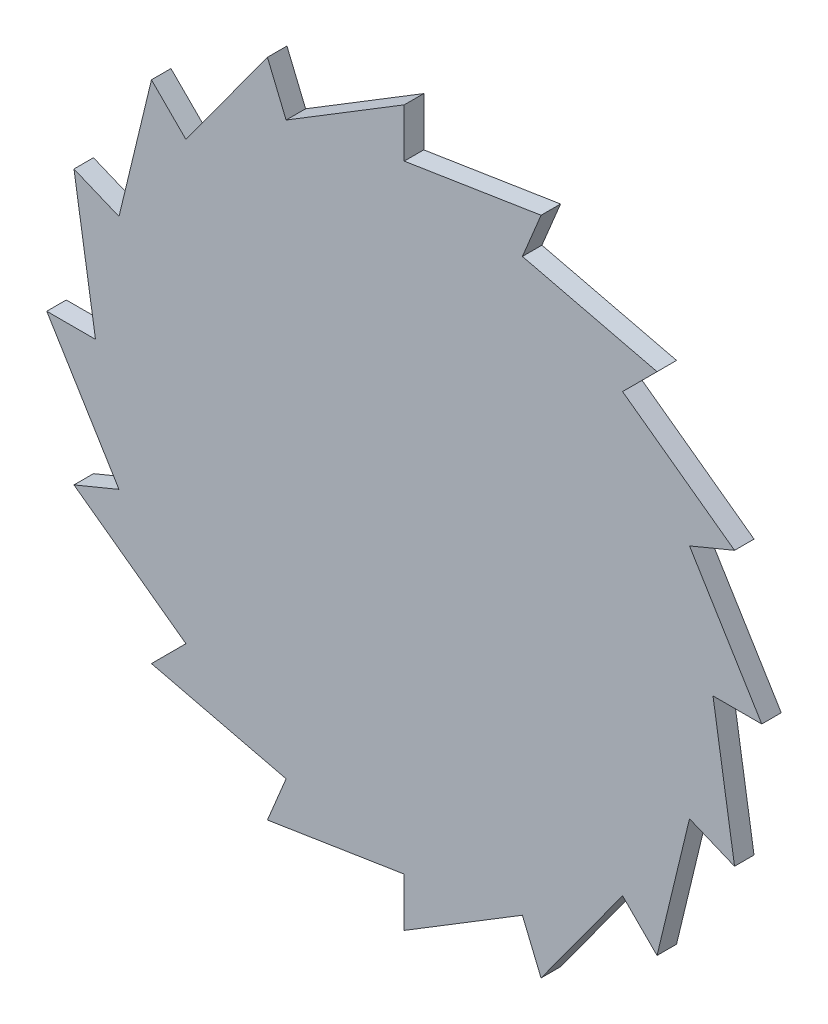
ISO-10303-21;
HEADER;
FILE_DESCRIPTION(('STEP AP214'),'2;1');
FILE_NAME('part.step','',(''),(''),'','','');
FILE_SCHEMA(('AUTOMOTIVE_DESIGN { 1 0 10303 214 1 1 1 1 }'));
ENDSEC;
DATA;
#1=APPLICATION_CONTEXT('core data for automotive mechanical design processes');
#2=APPLICATION_PROTOCOL_DEFINITION('international standard','automotive_design',2000,#1);
#3=PRODUCT_CONTEXT('',#1,'mechanical');
#4=PRODUCT('Part','Part','',(#3));
#5=PRODUCT_RELATED_PRODUCT_CATEGORY('part','',(#4));
#6=PRODUCT_DEFINITION_FORMATION('','',#4);
#7=PRODUCT_DEFINITION_CONTEXT('part definition',#1,'design');
#8=PRODUCT_DEFINITION('design','',#6,#7);
#9=PRODUCT_DEFINITION_SHAPE('','',#8);
#10=(LENGTH_UNIT() NAMED_UNIT(*) SI_UNIT(.MILLI.,.METRE.));
#11=(NAMED_UNIT(*) PLANE_ANGLE_UNIT() SI_UNIT($,.RADIAN.));
#12=(NAMED_UNIT(*) SI_UNIT($,.STERADIAN.) SOLID_ANGLE_UNIT());
#13=UNCERTAINTY_MEASURE_WITH_UNIT(LENGTH_MEASURE(1.E-05),#10,'distance_accuracy_value','');
#14=(GEOMETRIC_REPRESENTATION_CONTEXT(3) GLOBAL_UNCERTAINTY_ASSIGNED_CONTEXT((#13)) GLOBAL_UNIT_ASSIGNED_CONTEXT((#10,
#11,#12)) REPRESENTATION_CONTEXT('',''));
#15=CARTESIAN_POINT('',(0.,0.,0.));
#16=DIRECTION('',(0.,0.,1.));
#17=DIRECTION('',(1.,0.,0.));
#18=AXIS2_PLACEMENT_3D('',#15,#16,#17);
#19=CARTESIAN_POINT('',(0.,0.,3.));
#20=DIRECTION('',(0.,0.,1.));
#21=DIRECTION('',(1.,0.,0.));
#22=AXIS2_PLACEMENT_3D('',#19,#20,#21);
#23=PLANE('',#22);
#24=DIRECTION('',(-0.923879532511253,0.382683432365171,0.));
#25=VECTOR('',#24,1.);
#26=CARTESIAN_POINT('',(0.,0.,3.));
#27=LINE('',#26,#25);
#28=CARTESIAN_POINT('',(-43.8842777942864,18.1774630373464,3.));
#29=VERTEX_POINT('',#28);
#30=CARTESIAN_POINT('',(-50.8133742881189,21.0475887800844,3.));
#31=VERTEX_POINT('',#30);
#32=EDGE_CURVE('E451',#29,#31,#27,.T.);
#33=ORIENTED_EDGE('',*,*,#32,.T.);
#34=DIRECTION('',(-0.155507881197149,0.987834651591841,0.));
#35=VECTOR('',#34,1.);
#36=CARTESIAN_POINT('',(-46.3513216970647,-7.29676349800314,3.));
#37=LINE('',#36,#35);
#38=CARTESIAN_POINT('',(-47.5,0.,3.));
#39=VERTEX_POINT('',#38);
#40=EDGE_CURVE('E432',#39,#31,#37,.T.);
#41=ORIENTED_EDGE('',*,*,#40,.F.);
#42=DIRECTION('',(-1.,0.,0.));
#43=VECTOR('',#42,1.);
#44=CARTESIAN_POINT('',(0.,0.,3.));
#45=LINE('',#44,#43);
#46=CARTESIAN_POINT('',(-55.,0.,3.));
#47=VERTEX_POINT('',#46);
#48=EDGE_CURVE('E439',#39,#47,#45,.T.);
#49=ORIENTED_EDGE('',*,*,#48,.T.);
#50=DIRECTION('',(-0.521698503662581,0.853129926374772,0.));
#51=VECTOR('',#50,1.);
#52=CARTESIAN_POINT('',(-40.0306869201923,-24.4792133310718,3.));
#53=LINE('',#52,#51);
#54=CARTESIAN_POINT('',(-43.8842777942861,-18.1774630373418,3.));
#55=VERTEX_POINT('',#54);
#56=EDGE_CURVE('E558',#55,#47,#53,.T.);
#57=ORIENTED_EDGE('',*,*,#56,.F.);
#58=DIRECTION('',(-0.923879532511286,-0.382683432365091,0.));
#59=VECTOR('',#58,1.);
#60=CARTESIAN_POINT('',(0.,0.,3.));
#61=LINE('',#60,#59);
#62=CARTESIAN_POINT('',(-50.8133742881207,-21.04758878008,3.));
#63=VERTEX_POINT('',#62);
#64=EDGE_CURVE('E560',#55,#63,#61,.T.);
#65=ORIENTED_EDGE('',*,*,#64,.T.);
#66=DIRECTION('',(-0.808465258154098,0.588543903509184,0.));
#67=VECTOR('',#66,1.);
#68=CARTESIAN_POINT('',(-27.6157429388011,-37.9349248391062,3.));
#69=LINE('',#68,#67);
#70=CARTESIAN_POINT('',(-33.587572106361,-33.5875721063611,3.));
#71=VERTEX_POINT('',#70);
#72=EDGE_CURVE('E461',#71,#63,#69,.T.);
#73=ORIENTED_EDGE('',*,*,#72,.F.);
#74=DIRECTION('',(-0.707106781186547,-0.707106781186548,0.));
#75=VECTOR('',#74,1.);
#76=CARTESIAN_POINT('',(0.,0.,3.));
#77=LINE('',#76,#75);
#78=CARTESIAN_POINT('',(-38.8908729652601,-38.8908729652601,3.));
#79=VERTEX_POINT('',#78);
#80=EDGE_CURVE('E463',#71,#79,#77,.T.);
#81=ORIENTED_EDGE('',*,*,#80,.T.);
#82=DIRECTION('',(-0.972150505847468,0.234357406498093,0.));
#83=VECTOR('',#82,1.);
#84=CARTESIAN_POINT('',(-10.9965524323105,-45.6153879213366,3.));
#85=LINE('',#84,#83);
#86=CARTESIAN_POINT('',(-18.1774630373417,-43.8842777942862,3.));
#87=VERTEX_POINT('',#86);
#88=EDGE_CURVE('E571',#87,#79,#85,.T.);
#89=ORIENTED_EDGE('',*,*,#88,.F.);
#90=DIRECTION('',(-0.382683432365088,-0.923879532511288,0.));
#91=VECTOR('',#90,1.);
#92=CARTESIAN_POINT('',(0.,0.,3.));
#93=LINE('',#92,#91);
#94=CARTESIAN_POINT('',(-21.0475887800798,-50.8133742881208,3.));
#95=VERTEX_POINT('',#94);
#96=EDGE_CURVE('E574',#87,#95,#93,.T.);
#97=ORIENTED_EDGE('',*,*,#96,.T.);
#98=DIRECTION('',(-0.98783465159184,-0.155507881197153,0.));
#99=VECTOR('',#98,1.);
#100=CARTESIAN_POINT('',(7.29676349800329,-46.3513216970647,3.));
#101=LINE('',#100,#99);
#102=CARTESIAN_POINT('',(1.65845363595049E-13,-47.5,3.));
#103=VERTEX_POINT('',#102);
#104=EDGE_CURVE('E475',#103,#95,#101,.T.);
#105=ORIENTED_EDGE('',*,*,#104,.F.);
#106=DIRECTION('',(0.,-1.,0.));
#107=VECTOR('',#106,1.);
#108=CARTESIAN_POINT('',(0.,0.,3.));
#109=LINE('',#108,#107);
#110=CARTESIAN_POINT('',(1.92031473636372E-13,-55.,3.));
#111=VERTEX_POINT('',#110);
#112=EDGE_CURVE('E477',#103,#111,#109,.T.);
#113=ORIENTED_EDGE('',*,*,#112,.T.);
#114=DIRECTION('',(-0.85312992637477,-0.521698503662584,0.));
#115=VECTOR('',#114,1.);
#116=CARTESIAN_POINT('',(24.4792133310719,-40.0306869201922,3.));
#117=LINE('',#116,#115);
#118=CARTESIAN_POINT('',(18.177463037342,-43.8842777942861,3.));
#119=VERTEX_POINT('',#118);
#120=EDGE_CURVE('E673',#119,#111,#117,.T.);
#121=ORIENTED_EDGE('',*,*,#120,.F.);
#122=DIRECTION('',(0.382683432365094,-0.923879532511285,0.));
#123=VECTOR('',#122,1.);
#124=CARTESIAN_POINT('',(0.,0.,3.));
#125=LINE('',#124,#123);
#126=CARTESIAN_POINT('',(21.0475887800802,-50.8133742881207,3.));
#127=VERTEX_POINT('',#126);
#128=EDGE_CURVE('E676',#119,#127,#125,.T.);
#129=ORIENTED_EDGE('',*,*,#128,.T.);
#130=DIRECTION('',(-0.58854390350918,-0.808465258154101,0.));
#131=VECTOR('',#130,1.);
#132=CARTESIAN_POINT('',(37.9349248391063,-27.6157429388009,3.));
#133=LINE('',#132,#131);
#134=CARTESIAN_POINT('',(33.5875721063612,-33.5875721063608,3.));
#135=VERTEX_POINT('',#134);
#136=EDGE_CURVE('E489',#135,#127,#133,.T.);
#137=ORIENTED_EDGE('',*,*,#136,.F.);
#138=DIRECTION('',(0.707106781186551,-0.707106781186544,0.));
#139=VECTOR('',#138,1.);
#140=CARTESIAN_POINT('',(0.,0.,3.));
#141=LINE('',#140,#139);
#142=CARTESIAN_POINT('',(38.8908729652603,-38.8908729652599,3.));
#143=VERTEX_POINT('',#142);
#144=EDGE_CURVE('E491',#135,#143,#141,.T.);
#145=ORIENTED_EDGE('',*,*,#144,.T.);
#146=DIRECTION('',(-0.23435740649809,-0.972150505847469,0.));
#147=VECTOR('',#146,1.);
#148=CARTESIAN_POINT('',(45.6153879213366,-10.9965524323104,3.));
#149=LINE('',#148,#147);
#150=CARTESIAN_POINT('',(43.8842777942862,-18.1774630373415,3.));
#151=VERTEX_POINT('',#150);
#152=EDGE_CURVE('E655',#151,#143,#149,.T.);
#153=ORIENTED_EDGE('',*,*,#152,.F.);
#154=DIRECTION('',(0.923879532511289,-0.382683432365085,0.));
#155=VECTOR('',#154,1.);
#156=CARTESIAN_POINT('',(0.,0.,3.));
#157=LINE('',#156,#155);
#158=CARTESIAN_POINT('',(50.8133742881209,-21.0475887800796,3.));
#159=VERTEX_POINT('',#158);
#160=EDGE_CURVE('E658',#151,#159,#157,.T.);
#161=ORIENTED_EDGE('',*,*,#160,.T.);
#162=DIRECTION('',(0.155507881197156,-0.98783465159184,0.));
#163=VECTOR('',#162,1.);
#164=CARTESIAN_POINT('',(46.3513216970647,7.29676349800343,3.));
#165=LINE('',#164,#163);
#166=CARTESIAN_POINT('',(47.5,3.31690727190098E-13,3.));
#167=VERTEX_POINT('',#166);
#168=EDGE_CURVE('E503',#167,#159,#165,.T.);
#169=ORIENTED_EDGE('',*,*,#168,.F.);
#170=DIRECTION('',(1.,0.,0.));
#171=VECTOR('',#170,1.);
#172=CARTESIAN_POINT('',(0.,0.,3.));
#173=LINE('',#172,#171);
#174=CARTESIAN_POINT('',(55.,3.84062947272745E-13,3.));
#175=VERTEX_POINT('',#174);
#176=EDGE_CURVE('E505',#167,#175,#173,.T.);
#177=ORIENTED_EDGE('',*,*,#176,.T.);
#178=DIRECTION('',(0.521698503662588,-0.853129926374768,0.));
#179=VECTOR('',#178,1.);
#180=CARTESIAN_POINT('',(40.0306869201921,24.4792133310721,3.));
#181=LINE('',#180,#179);
#182=CARTESIAN_POINT('',(43.884277794286,18.1774630373421,3.));
#183=VERTEX_POINT('',#182);
#184=EDGE_CURVE('E637',#183,#175,#181,.T.);
#185=ORIENTED_EDGE('',*,*,#184,.F.);
#186=DIRECTION('',(0.923879532511284,0.382683432365097,0.));
#187=VECTOR('',#186,1.);
#188=CARTESIAN_POINT('',(0.,0.,3.));
#189=LINE('',#188,#187);
#190=CARTESIAN_POINT('',(50.8133742881206,21.0475887800803,3.));
#191=VERTEX_POINT('',#190);
#192=EDGE_CURVE('E640',#183,#191,#189,.T.);
#193=ORIENTED_EDGE('',*,*,#192,.T.);
#194=DIRECTION('',(0.808465258154102,-0.588543903509178,0.));
#195=VECTOR('',#194,1.);
#196=CARTESIAN_POINT('',(27.6157429388008,37.9349248391064,3.));
#197=LINE('',#196,#195);
#198=CARTESIAN_POINT('',(33.5875721063607,33.5875721063613,3.));
#199=VERTEX_POINT('',#198);
#200=EDGE_CURVE('E517',#199,#191,#197,.T.);
#201=ORIENTED_EDGE('',*,*,#200,.F.);
#202=DIRECTION('',(0.707106781186541,0.707106781186554,0.));
#203=VECTOR('',#202,1.);
#204=CARTESIAN_POINT('',(0.,0.,3.));
#205=LINE('',#204,#203);
#206=CARTESIAN_POINT('',(38.8908729652598,38.8908729652605,3.));
#207=VERTEX_POINT('',#206);
#208=EDGE_CURVE('E519',#199,#207,#205,.T.);
#209=ORIENTED_EDGE('',*,*,#208,.T.);
#210=DIRECTION('',(0.97215050584747,-0.234357406498086,0.));
#211=VECTOR('',#210,1.);
#212=CARTESIAN_POINT('',(10.9965524323102,45.6153879213367,3.));
#213=LINE('',#212,#211);
#214=CARTESIAN_POINT('',(18.1774630373413,43.8842777942863,3.));
#215=VERTEX_POINT('',#214);
#216=EDGE_CURVE('E619',#215,#207,#213,.T.);
#217=ORIENTED_EDGE('',*,*,#216,.F.);
#218=DIRECTION('',(0.38268343236508,0.923879532511291,0.));
#219=VECTOR('',#218,1.);
#220=CARTESIAN_POINT('',(0.,0.,3.));
#221=LINE('',#220,#219);
#222=CARTESIAN_POINT('',(21.0475887800794,50.813374288121,3.));
#223=VERTEX_POINT('',#222);
#224=EDGE_CURVE('E622',#215,#223,#221,.T.);
#225=ORIENTED_EDGE('',*,*,#224,.T.);
#226=DIRECTION('',(0.987834651591839,0.15550788119716,0.));
#227=VECTOR('',#226,1.);
#228=CARTESIAN_POINT('',(-7.29676349800362,46.3513216970647,3.));
#229=LINE('',#228,#227);
#230=CARTESIAN_POINT('',(-4.97536090785147E-13,47.5,3.));
#231=VERTEX_POINT('',#230);
#232=EDGE_CURVE('E531',#231,#223,#229,.T.);
#233=ORIENTED_EDGE('',*,*,#232,.F.);
#234=DIRECTION('',(0.,1.,0.));
#235=VECTOR('',#234,1.);
#236=CARTESIAN_POINT('',(0.,0.,3.));
#237=LINE('',#236,#235);
#238=CARTESIAN_POINT('',(-5.76094420909117E-13,55.,3.));
#239=VERTEX_POINT('',#238);
#240=EDGE_CURVE('E533',#231,#239,#237,.T.);
#241=ORIENTED_EDGE('',*,*,#240,.T.);
#242=DIRECTION('',(0.853129926374766,0.521698503662591,0.));
#243=VECTOR('',#242,1.);
#244=CARTESIAN_POINT('',(-24.4792133310722,40.030686920192,3.));
#245=LINE('',#244,#243);
#246=CARTESIAN_POINT('',(-18.1774630373423,43.8842777942859,3.));
#247=VERTEX_POINT('',#246);
#248=EDGE_CURVE('E601',#247,#239,#245,.T.);
#249=ORIENTED_EDGE('',*,*,#248,.F.);
#250=DIRECTION('',(-0.3826834323651,0.923879532511283,0.));
#251=VECTOR('',#250,1.);
#252=CARTESIAN_POINT('',(0.,0.,3.));
#253=LINE('',#252,#251);
#254=CARTESIAN_POINT('',(-21.0475887800805,50.8133742881205,3.));
#255=VERTEX_POINT('',#254);
#256=EDGE_CURVE('E604',#247,#255,#253,.T.);
#257=ORIENTED_EDGE('',*,*,#256,.T.);
#258=DIRECTION('',(0.588543903509176,0.808465258154104,0.));
#259=VECTOR('',#258,1.);
#260=CARTESIAN_POINT('',(-37.9349248391064,27.6157429388007,3.));
#261=LINE('',#260,#259);
#262=CARTESIAN_POINT('',(-33.5875721063614,33.5875721063606,3.));
#263=VERTEX_POINT('',#262);
#264=EDGE_CURVE('E545',#263,#255,#261,.T.);
#265=ORIENTED_EDGE('',*,*,#264,.F.);
#266=DIRECTION('',(-0.707106781186556,0.707106781186539,0.));
#267=VECTOR('',#266,1.);
#268=CARTESIAN_POINT('',(0.,0.,3.));
#269=LINE('',#268,#267);
#270=CARTESIAN_POINT('',(-38.8908729652606,38.8908729652597,3.));
#271=VERTEX_POINT('',#270);
#272=EDGE_CURVE('E547',#263,#271,#269,.T.);
#273=ORIENTED_EDGE('',*,*,#272,.T.);
#274=DIRECTION('',(0.234357406498083,0.97215050584747,0.));
#275=VECTOR('',#274,1.);
#276=CARTESIAN_POINT('',(-45.6153879213367,10.9965524323101,3.));
#277=LINE('',#276,#275);
#278=EDGE_CURVE('E589',#29,#271,#277,.T.);
#279=ORIENTED_EDGE('',*,*,#278,.F.);
#280=EDGE_LOOP('',(#33,#41,#49,#57,#65,#73,#81,#89,#97,#105,#113,#121,#129,#137,#145,#153,#161,
#169,#177,#185,#193,#201,#209,#217,#225,#233,#241,#249,#257,#265,#273,#279));
#281=FACE_BOUND('',#280,.T.);
#282=ADVANCED_FACE('F217',(#281),#23,.T.);
#283=CARTESIAN_POINT('',(0.,0.,0.));
#284=DIRECTION('',(0.,0.,1.));
#285=DIRECTION('',(1.,0.,0.));
#286=AXIS2_PLACEMENT_3D('',#283,#284,#285);
#287=PLANE('',#286);
#288=CARTESIAN_POINT('',(0.,0.,0.));
#289=DIRECTION('',(0.,0.,-1.));
#290=DIRECTION('',(-1.,0.,0.));
#291=AXIS2_PLACEMENT_3D('',#288,#289,#290);
#292=CIRCLE('',#291,2.5);
#293=CARTESIAN_POINT('',(-2.5,0.,0.));
#294=VERTEX_POINT('',#293);
#295=EDGE_CURVE('E456',#294,#294,#292,.T.);
#296=ORIENTED_EDGE('',*,*,#295,.F.);
#297=EDGE_LOOP('',(#296));
#298=FACE_BOUND('',#297,.T.);
#299=DIRECTION('',(-0.155507881197149,0.987834651591841,0.));
#300=VECTOR('',#299,1.);
#301=CARTESIAN_POINT('',(-46.3513216970647,-7.29676349800314,0.));
#302=LINE('',#301,#300);
#303=CARTESIAN_POINT('',(-47.5,0.,0.));
#304=VERTEX_POINT('',#303);
#305=CARTESIAN_POINT('',(-50.8133742881189,21.0475887800844,0.));
#306=VERTEX_POINT('',#305);
#307=EDGE_CURVE('E435',#304,#306,#302,.T.);
#308=ORIENTED_EDGE('',*,*,#307,.T.);
#309=DIRECTION('',(-0.923879532511253,0.382683432365171,0.));
#310=VECTOR('',#309,1.);
#311=CARTESIAN_POINT('',(0.,0.,0.));
#312=LINE('',#311,#310);
#313=CARTESIAN_POINT('',(-43.8842777942864,18.1774630373464,0.));
#314=VERTEX_POINT('',#313);
#315=EDGE_CURVE('E592',#314,#306,#312,.T.);
#316=ORIENTED_EDGE('',*,*,#315,.F.);
#317=DIRECTION('',(0.234357406498083,0.97215050584747,0.));
#318=VECTOR('',#317,1.);
#319=CARTESIAN_POINT('',(-45.6153879213367,10.9965524323101,0.));
#320=LINE('',#319,#318);
#321=CARTESIAN_POINT('',(-38.8908729652606,38.8908729652597,0.));
#322=VERTEX_POINT('',#321);
#323=EDGE_CURVE('E241',#314,#322,#320,.T.);
#324=ORIENTED_EDGE('',*,*,#323,.T.);
#325=DIRECTION('',(-0.707106781186556,0.707106781186539,0.));
#326=VECTOR('',#325,1.);
#327=CARTESIAN_POINT('',(0.,0.,0.));
#328=LINE('',#327,#326);
#329=CARTESIAN_POINT('',(-33.5875721063614,33.5875721063606,0.));
#330=VERTEX_POINT('',#329);
#331=EDGE_CURVE('E548',#330,#322,#328,.T.);
#332=ORIENTED_EDGE('',*,*,#331,.F.);
#333=DIRECTION('',(0.588543903509176,0.808465258154104,0.));
#334=VECTOR('',#333,1.);
#335=CARTESIAN_POINT('',(-37.9349248391064,27.6157429388007,0.));
#336=LINE('',#335,#334);
#337=CARTESIAN_POINT('',(-21.0475887800805,50.8133742881205,0.));
#338=VERTEX_POINT('',#337);
#339=EDGE_CURVE('E543',#330,#338,#336,.T.);
#340=ORIENTED_EDGE('',*,*,#339,.T.);
#341=DIRECTION('',(-0.3826834323651,0.923879532511283,0.));
#342=VECTOR('',#341,1.);
#343=CARTESIAN_POINT('',(0.,0.,0.));
#344=LINE('',#343,#342);
#345=CARTESIAN_POINT('',(-18.1774630373423,43.8842777942859,0.));
#346=VERTEX_POINT('',#345);
#347=EDGE_CURVE('E605',#346,#338,#344,.T.);
#348=ORIENTED_EDGE('',*,*,#347,.F.);
#349=DIRECTION('',(0.853129926374766,0.521698503662591,0.));
#350=VECTOR('',#349,1.);
#351=CARTESIAN_POINT('',(-24.4792133310722,40.030686920192,0.));
#352=LINE('',#351,#350);
#353=CARTESIAN_POINT('',(-5.76094420909117E-13,55.,0.));
#354=VERTEX_POINT('',#353);
#355=EDGE_CURVE('E609',#346,#354,#352,.T.);
#356=ORIENTED_EDGE('',*,*,#355,.T.);
#357=DIRECTION('',(0.,1.,0.));
#358=VECTOR('',#357,1.);
#359=CARTESIAN_POINT('',(0.,0.,0.));
#360=LINE('',#359,#358);
#361=CARTESIAN_POINT('',(-4.97536090785147E-13,47.5,0.));
#362=VERTEX_POINT('',#361);
#363=EDGE_CURVE('E534',#362,#354,#360,.T.);
#364=ORIENTED_EDGE('',*,*,#363,.F.);
#365=DIRECTION('',(0.987834651591839,0.15550788119716,0.));
#366=VECTOR('',#365,1.);
#367=CARTESIAN_POINT('',(-7.29676349800362,46.3513216970647,0.));
#368=LINE('',#367,#366);
#369=CARTESIAN_POINT('',(21.0475887800794,50.813374288121,0.));
#370=VERTEX_POINT('',#369);
#371=EDGE_CURVE('E529',#362,#370,#368,.T.);
#372=ORIENTED_EDGE('',*,*,#371,.T.);
#373=DIRECTION('',(0.38268343236508,0.923879532511291,0.));
#374=VECTOR('',#373,1.);
#375=CARTESIAN_POINT('',(0.,0.,0.));
#376=LINE('',#375,#374);
#377=CARTESIAN_POINT('',(18.1774630373413,43.8842777942863,0.));
#378=VERTEX_POINT('',#377);
#379=EDGE_CURVE('E623',#378,#370,#376,.T.);
#380=ORIENTED_EDGE('',*,*,#379,.F.);
#381=DIRECTION('',(0.97215050584747,-0.234357406498086,0.));
#382=VECTOR('',#381,1.);
#383=CARTESIAN_POINT('',(10.9965524323102,45.6153879213367,0.));
#384=LINE('',#383,#382);
#385=CARTESIAN_POINT('',(38.8908729652598,38.8908729652605,0.));
#386=VERTEX_POINT('',#385);
#387=EDGE_CURVE('E627',#378,#386,#384,.T.);
#388=ORIENTED_EDGE('',*,*,#387,.T.);
#389=DIRECTION('',(0.707106781186541,0.707106781186554,0.));
#390=VECTOR('',#389,1.);
#391=CARTESIAN_POINT('',(0.,0.,0.));
#392=LINE('',#391,#390);
#393=CARTESIAN_POINT('',(33.5875721063607,33.5875721063613,0.));
#394=VERTEX_POINT('',#393);
#395=EDGE_CURVE('E520',#394,#386,#392,.T.);
#396=ORIENTED_EDGE('',*,*,#395,.F.);
#397=DIRECTION('',(0.808465258154102,-0.588543903509178,0.));
#398=VECTOR('',#397,1.);
#399=CARTESIAN_POINT('',(27.6157429388008,37.9349248391064,0.));
#400=LINE('',#399,#398);
#401=CARTESIAN_POINT('',(50.8133742881206,21.0475887800803,0.));
#402=VERTEX_POINT('',#401);
#403=EDGE_CURVE('E515',#394,#402,#400,.T.);
#404=ORIENTED_EDGE('',*,*,#403,.T.);
#405=DIRECTION('',(0.923879532511284,0.382683432365097,0.));
#406=VECTOR('',#405,1.);
#407=CARTESIAN_POINT('',(0.,0.,0.));
#408=LINE('',#407,#406);
#409=CARTESIAN_POINT('',(43.884277794286,18.1774630373421,0.));
#410=VERTEX_POINT('',#409);
#411=EDGE_CURVE('E641',#410,#402,#408,.T.);
#412=ORIENTED_EDGE('',*,*,#411,.F.);
#413=DIRECTION('',(0.521698503662588,-0.853129926374768,0.));
#414=VECTOR('',#413,1.);
#415=CARTESIAN_POINT('',(40.0306869201921,24.4792133310721,0.));
#416=LINE('',#415,#414);
#417=CARTESIAN_POINT('',(55.,3.84062947272745E-13,0.));
#418=VERTEX_POINT('',#417);
#419=EDGE_CURVE('E645',#410,#418,#416,.T.);
#420=ORIENTED_EDGE('',*,*,#419,.T.);
#421=DIRECTION('',(1.,0.,0.));
#422=VECTOR('',#421,1.);
#423=CARTESIAN_POINT('',(0.,0.,0.));
#424=LINE('',#423,#422);
#425=CARTESIAN_POINT('',(47.5,3.31690727190098E-13,0.));
#426=VERTEX_POINT('',#425);
#427=EDGE_CURVE('E506',#426,#418,#424,.T.);
#428=ORIENTED_EDGE('',*,*,#427,.F.);
#429=DIRECTION('',(0.155507881197156,-0.98783465159184,0.));
#430=VECTOR('',#429,1.);
#431=CARTESIAN_POINT('',(46.3513216970647,7.29676349800343,0.));
#432=LINE('',#431,#430);
#433=CARTESIAN_POINT('',(50.8133742881209,-21.0475887800796,0.));
#434=VERTEX_POINT('',#433);
#435=EDGE_CURVE('E501',#426,#434,#432,.T.);
#436=ORIENTED_EDGE('',*,*,#435,.T.);
#437=DIRECTION('',(0.923879532511289,-0.382683432365085,0.));
#438=VECTOR('',#437,1.);
#439=CARTESIAN_POINT('',(0.,0.,0.));
#440=LINE('',#439,#438);
#441=CARTESIAN_POINT('',(43.8842777942862,-18.1774630373415,0.));
#442=VERTEX_POINT('',#441);
#443=EDGE_CURVE('E659',#442,#434,#440,.T.);
#444=ORIENTED_EDGE('',*,*,#443,.F.);
#445=DIRECTION('',(-0.23435740649809,-0.972150505847469,0.));
#446=VECTOR('',#445,1.);
#447=CARTESIAN_POINT('',(45.6153879213366,-10.9965524323104,0.));
#448=LINE('',#447,#446);
#449=CARTESIAN_POINT('',(38.8908729652603,-38.8908729652599,0.));
#450=VERTEX_POINT('',#449);
#451=EDGE_CURVE('E663',#442,#450,#448,.T.);
#452=ORIENTED_EDGE('',*,*,#451,.T.);
#453=DIRECTION('',(0.707106781186551,-0.707106781186544,0.));
#454=VECTOR('',#453,1.);
#455=CARTESIAN_POINT('',(0.,0.,0.));
#456=LINE('',#455,#454);
#457=CARTESIAN_POINT('',(33.5875721063612,-33.5875721063608,0.));
#458=VERTEX_POINT('',#457);
#459=EDGE_CURVE('E492',#458,#450,#456,.T.);
#460=ORIENTED_EDGE('',*,*,#459,.F.);
#461=DIRECTION('',(-0.58854390350918,-0.808465258154101,0.));
#462=VECTOR('',#461,1.);
#463=CARTESIAN_POINT('',(37.9349248391063,-27.6157429388009,0.));
#464=LINE('',#463,#462);
#465=CARTESIAN_POINT('',(21.0475887800802,-50.8133742881207,0.));
#466=VERTEX_POINT('',#465);
#467=EDGE_CURVE('E487',#458,#466,#464,.T.);
#468=ORIENTED_EDGE('',*,*,#467,.T.);
#469=DIRECTION('',(0.382683432365094,-0.923879532511285,0.));
#470=VECTOR('',#469,1.);
#471=CARTESIAN_POINT('',(0.,0.,0.));
#472=LINE('',#471,#470);
#473=CARTESIAN_POINT('',(18.177463037342,-43.8842777942861,0.));
#474=VERTEX_POINT('',#473);
#475=EDGE_CURVE('E677',#474,#466,#472,.T.);
#476=ORIENTED_EDGE('',*,*,#475,.F.);
#477=DIRECTION('',(-0.85312992637477,-0.521698503662584,0.));
#478=VECTOR('',#477,1.);
#479=CARTESIAN_POINT('',(24.4792133310719,-40.0306869201922,0.));
#480=LINE('',#479,#478);
#481=CARTESIAN_POINT('',(1.92031473636372E-13,-55.,0.));
#482=VERTEX_POINT('',#481);
#483=EDGE_CURVE('E586',#474,#482,#480,.T.);
#484=ORIENTED_EDGE('',*,*,#483,.T.);
#485=DIRECTION('',(0.,-1.,0.));
#486=VECTOR('',#485,1.);
#487=CARTESIAN_POINT('',(0.,0.,0.));
#488=LINE('',#487,#486);
#489=CARTESIAN_POINT('',(1.65845363595049E-13,-47.5,0.));
#490=VERTEX_POINT('',#489);
#491=EDGE_CURVE('E478',#490,#482,#488,.T.);
#492=ORIENTED_EDGE('',*,*,#491,.F.);
#493=DIRECTION('',(-0.98783465159184,-0.155507881197153,0.));
#494=VECTOR('',#493,1.);
#495=CARTESIAN_POINT('',(7.29676349800329,-46.3513216970647,0.));
#496=LINE('',#495,#494);
#497=CARTESIAN_POINT('',(-21.0475887800798,-50.8133742881208,0.));
#498=VERTEX_POINT('',#497);
#499=EDGE_CURVE('E473',#490,#498,#496,.T.);
#500=ORIENTED_EDGE('',*,*,#499,.T.);
#501=DIRECTION('',(-0.382683432365088,-0.923879532511288,0.));
#502=VECTOR('',#501,1.);
#503=CARTESIAN_POINT('',(0.,0.,0.));
#504=LINE('',#503,#502);
#505=CARTESIAN_POINT('',(-18.1774630373417,-43.8842777942862,0.));
#506=VERTEX_POINT('',#505);
#507=EDGE_CURVE('E575',#506,#498,#504,.T.);
#508=ORIENTED_EDGE('',*,*,#507,.F.);
#509=DIRECTION('',(-0.972150505847468,0.234357406498093,0.));
#510=VECTOR('',#509,1.);
#511=CARTESIAN_POINT('',(-10.9965524323105,-45.6153879213366,0.));
#512=LINE('',#511,#510);
#513=CARTESIAN_POINT('',(-38.8908729652601,-38.8908729652601,0.));
#514=VERTEX_POINT('',#513);
#515=EDGE_CURVE('E569',#506,#514,#512,.T.);
#516=ORIENTED_EDGE('',*,*,#515,.T.);
#517=DIRECTION('',(-0.707106781186547,-0.707106781186548,0.));
#518=VECTOR('',#517,1.);
#519=CARTESIAN_POINT('',(0.,0.,0.));
#520=LINE('',#519,#518);
#521=CARTESIAN_POINT('',(-33.587572106361,-33.5875721063611,0.));
#522=VERTEX_POINT('',#521);
#523=EDGE_CURVE('E464',#522,#514,#520,.T.);
#524=ORIENTED_EDGE('',*,*,#523,.F.);
#525=DIRECTION('',(-0.808465258154098,0.588543903509184,0.));
#526=VECTOR('',#525,1.);
#527=CARTESIAN_POINT('',(-27.6157429388011,-37.9349248391062,0.));
#528=LINE('',#527,#526);
#529=CARTESIAN_POINT('',(-50.8133742881207,-21.04758878008,0.));
#530=VERTEX_POINT('',#529);
#531=EDGE_CURVE('E438',#522,#530,#528,.T.);
#532=ORIENTED_EDGE('',*,*,#531,.T.);
#533=DIRECTION('',(-0.923879532511286,-0.382683432365091,0.));
#534=VECTOR('',#533,1.);
#535=CARTESIAN_POINT('',(0.,0.,0.));
#536=LINE('',#535,#534);
#537=CARTESIAN_POINT('',(-43.8842777942861,-18.1774630373418,0.));
#538=VERTEX_POINT('',#537);
#539=EDGE_CURVE('E561',#538,#530,#536,.T.);
#540=ORIENTED_EDGE('',*,*,#539,.F.);
#541=DIRECTION('',(-0.521698503662581,0.853129926374772,0.));
#542=VECTOR('',#541,1.);
#543=CARTESIAN_POINT('',(-40.0306869201923,-24.4792133310718,0.));
#544=LINE('',#543,#542);
#545=CARTESIAN_POINT('',(-55.,0.,0.));
#546=VERTEX_POINT('',#545);
#547=EDGE_CURVE('E234',#538,#546,#544,.T.);
#548=ORIENTED_EDGE('',*,*,#547,.T.);
#549=DIRECTION('',(-1.,0.,0.));
#550=VECTOR('',#549,1.);
#551=CARTESIAN_POINT('',(0.,0.,0.));
#552=LINE('',#551,#550);
#553=EDGE_CURVE('E452',#304,#546,#552,.T.);
#554=ORIENTED_EDGE('',*,*,#553,.F.);
#555=EDGE_LOOP('',(#308,#316,#324,#332,#340,#348,#356,#364,#372,#380,#388,#396,#404,#412,#420,
#428,#436,#444,#452,#460,#468,#476,#484,#492,#500,#508,#516,#524,#532,#540,#548,#554));
#556=FACE_BOUND('',#555,.T.);
#557=ADVANCED_FACE('F219',(#298,#556),#287,.F.);
#558=CARTESIAN_POINT('',(-10.9965524323105,-45.6153879213366,3.));
#559=DIRECTION('',(-0.234357406498093,-0.972150505847468,0.));
#560=DIRECTION('',(0.972150505847468,-0.234357406498093,0.));
#561=AXIS2_PLACEMENT_3D('',#558,#559,#560);
#562=PLANE('',#561);
#563=ORIENTED_EDGE('',*,*,#515,.F.);
#564=DIRECTION('',(0.,0.,-1.));
#565=VECTOR('',#564,1.);
#566=CARTESIAN_POINT('',(-18.1774630373417,-43.8842777942862,3.));
#567=LINE('',#566,#565);
#568=EDGE_CURVE('E578',#87,#506,#567,.T.);
#569=ORIENTED_EDGE('',*,*,#568,.F.);
#570=ORIENTED_EDGE('',*,*,#88,.T.);
#571=DIRECTION('',(0.,0.,-1.));
#572=VECTOR('',#571,1.);
#573=CARTESIAN_POINT('',(-38.8908729652601,-38.8908729652601,3.));
#574=LINE('',#573,#572);
#575=EDGE_CURVE('E583',#79,#514,#574,.T.);
#576=ORIENTED_EDGE('',*,*,#575,.T.);
#577=EDGE_LOOP('',(#563,#569,#570,#576));
#578=FACE_BOUND('',#577,.T.);
#579=ADVANCED_FACE('F712',(#578),#562,.T.);
#580=CARTESIAN_POINT('',(0.,0.,3.));
#581=DIRECTION('',(0.923879532511288,-0.382683432365088,0.));
#582=DIRECTION('',(0.382683432365088,0.923879532511288,0.));
#583=AXIS2_PLACEMENT_3D('',#580,#581,#582);
#584=PLANE('',#583);
#585=ORIENTED_EDGE('',*,*,#507,.T.);
#586=DIRECTION('',(0.,0.,-1.));
#587=VECTOR('',#586,1.);
#588=CARTESIAN_POINT('',(-21.0475887800798,-50.8133742881208,3.));
#589=LINE('',#588,#587);
#590=EDGE_CURVE('E485',#95,#498,#589,.T.);
#591=ORIENTED_EDGE('',*,*,#590,.F.);
#592=ORIENTED_EDGE('',*,*,#96,.F.);
#593=ORIENTED_EDGE('',*,*,#568,.T.);
#594=EDGE_LOOP('',(#585,#591,#592,#593));
#595=FACE_BOUND('',#594,.T.);
#596=ADVANCED_FACE('F704',(#595),#584,.F.);
#597=CARTESIAN_POINT('',(24.4792133310719,-40.0306869201922,3.));
#598=DIRECTION('',(0.521698503662584,-0.85312992637477,0.));
#599=DIRECTION('',(0.85312992637477,0.521698503662584,0.));
#600=AXIS2_PLACEMENT_3D('',#597,#598,#599);
#601=PLANE('',#600);
#602=ORIENTED_EDGE('',*,*,#483,.F.);
#603=DIRECTION('',(0.,0.,-1.));
#604=VECTOR('',#603,1.);
#605=CARTESIAN_POINT('',(18.177463037342,-43.8842777942861,3.));
#606=LINE('',#605,#604);
#607=EDGE_CURVE('E221',#119,#474,#606,.T.);
#608=ORIENTED_EDGE('',*,*,#607,.F.);
#609=ORIENTED_EDGE('',*,*,#120,.T.);
#610=DIRECTION('',(0.,0.,-1.));
#611=VECTOR('',#610,1.);
#612=CARTESIAN_POINT('',(1.92031473636372E-13,-55.,3.));
#613=LINE('',#612,#611);
#614=EDGE_CURVE('E666',#111,#482,#613,.T.);
#615=ORIENTED_EDGE('',*,*,#614,.T.);
#616=EDGE_LOOP('',(#602,#608,#609,#615));
#617=FACE_BOUND('',#616,.T.);
#618=ADVANCED_FACE('F702',(#617),#601,.T.);
#619=CARTESIAN_POINT('',(0.,0.,3.));
#620=DIRECTION('',(0.923879532511285,0.382683432365094,0.));
#621=DIRECTION('',(-0.382683432365094,0.923879532511285,0.));
#622=AXIS2_PLACEMENT_3D('',#619,#620,#621);
#623=PLANE('',#622);
#624=ORIENTED_EDGE('',*,*,#475,.T.);
#625=DIRECTION('',(0.,0.,-1.));
#626=VECTOR('',#625,1.);
#627=CARTESIAN_POINT('',(21.0475887800802,-50.8133742881207,3.));
#628=LINE('',#627,#626);
#629=EDGE_CURVE('E499',#127,#466,#628,.T.);
#630=ORIENTED_EDGE('',*,*,#629,.F.);
#631=ORIENTED_EDGE('',*,*,#128,.F.);
#632=ORIENTED_EDGE('',*,*,#607,.T.);
#633=EDGE_LOOP('',(#624,#630,#631,#632));
#634=FACE_BOUND('',#633,.T.);
#635=ADVANCED_FACE('F689',(#634),#623,.F.);
#636=CARTESIAN_POINT('',(45.6153879213366,-10.9965524323104,3.));
#637=DIRECTION('',(0.972150505847468,-0.23435740649809,0.));
#638=DIRECTION('',(0.23435740649809,0.972150505847469,0.));
#639=AXIS2_PLACEMENT_3D('',#636,#637,#638);
#640=PLANE('',#639);
#641=ORIENTED_EDGE('',*,*,#451,.F.);
#642=DIRECTION('',(0.,0.,-1.));
#643=VECTOR('',#642,1.);
#644=CARTESIAN_POINT('',(43.8842777942862,-18.1774630373415,3.));
#645=LINE('',#644,#643);
#646=EDGE_CURVE('E662',#151,#442,#645,.T.);
#647=ORIENTED_EDGE('',*,*,#646,.F.);
#648=ORIENTED_EDGE('',*,*,#152,.T.);
#649=DIRECTION('',(0.,0.,-1.));
#650=VECTOR('',#649,1.);
#651=CARTESIAN_POINT('',(38.8908729652603,-38.8908729652599,3.));
#652=LINE('',#651,#650);
#653=EDGE_CURVE('E648',#143,#450,#652,.T.);
#654=ORIENTED_EDGE('',*,*,#653,.T.);
#655=EDGE_LOOP('',(#641,#647,#648,#654));
#656=FACE_BOUND('',#655,.T.);
#657=ADVANCED_FACE('F710',(#656),#640,.T.);
#658=CARTESIAN_POINT('',(0.,0.,3.));
#659=DIRECTION('',(0.382683432365084,0.923879532511289,0.));
#660=DIRECTION('',(-0.923879532511289,0.382683432365085,0.));
#661=AXIS2_PLACEMENT_3D('',#658,#659,#660);
#662=PLANE('',#661);
#663=ORIENTED_EDGE('',*,*,#443,.T.);
#664=DIRECTION('',(0.,0.,-1.));
#665=VECTOR('',#664,1.);
#666=CARTESIAN_POINT('',(50.8133742881209,-21.0475887800796,3.));
#667=LINE('',#666,#665);
#668=EDGE_CURVE('E513',#159,#434,#667,.T.);
#669=ORIENTED_EDGE('',*,*,#668,.F.);
#670=ORIENTED_EDGE('',*,*,#160,.F.);
#671=ORIENTED_EDGE('',*,*,#646,.T.);
#672=EDGE_LOOP('',(#663,#669,#670,#671));
#673=FACE_BOUND('',#672,.T.);
#674=ADVANCED_FACE('F836',(#673),#662,.F.);
#675=CARTESIAN_POINT('',(40.0306869201921,24.4792133310721,3.));
#676=DIRECTION('',(0.853129926374768,0.521698503662588,0.));
#677=DIRECTION('',(-0.521698503662588,0.853129926374768,0.));
#678=AXIS2_PLACEMENT_3D('',#675,#676,#677);
#679=PLANE('',#678);
#680=ORIENTED_EDGE('',*,*,#419,.F.);
#681=DIRECTION('',(0.,0.,-1.));
#682=VECTOR('',#681,1.);
#683=CARTESIAN_POINT('',(43.884277794286,18.1774630373421,3.));
#684=LINE('',#683,#682);
#685=EDGE_CURVE('E644',#183,#410,#684,.T.);
#686=ORIENTED_EDGE('',*,*,#685,.F.);
#687=ORIENTED_EDGE('',*,*,#184,.T.);
#688=DIRECTION('',(0.,0.,-1.));
#689=VECTOR('',#688,1.);
#690=CARTESIAN_POINT('',(55.,3.84062947272745E-13,3.));
#691=LINE('',#690,#689);
#692=EDGE_CURVE('E630',#175,#418,#691,.T.);
#693=ORIENTED_EDGE('',*,*,#692,.T.);
#694=EDGE_LOOP('',(#680,#686,#687,#693));
#695=FACE_BOUND('',#694,.T.);
#696=ADVANCED_FACE('F832',(#695),#679,.T.);
#697=CARTESIAN_POINT('',(0.,0.,3.));
#698=DIRECTION('',(-0.382683432365097,0.923879532511284,0.));
#699=DIRECTION('',(-0.923879532511284,-0.382683432365097,0.));
#700=AXIS2_PLACEMENT_3D('',#697,#698,#699);
#701=PLANE('',#700);
#702=ORIENTED_EDGE('',*,*,#411,.T.);
#703=DIRECTION('',(0.,0.,-1.));
#704=VECTOR('',#703,1.);
#705=CARTESIAN_POINT('',(50.8133742881206,21.0475887800803,3.));
#706=LINE('',#705,#704);
#707=EDGE_CURVE('E527',#191,#402,#706,.T.);
#708=ORIENTED_EDGE('',*,*,#707,.F.);
#709=ORIENTED_EDGE('',*,*,#192,.F.);
#710=ORIENTED_EDGE('',*,*,#685,.T.);
#711=EDGE_LOOP('',(#702,#708,#709,#710));
#712=FACE_BOUND('',#711,.T.);
#713=ADVANCED_FACE('F828',(#712),#701,.F.);
#714=CARTESIAN_POINT('',(10.9965524323102,45.6153879213367,3.));
#715=DIRECTION('',(0.234357406498086,0.972150505847469,0.));
#716=DIRECTION('',(-0.97215050584747,0.234357406498086,0.));
#717=AXIS2_PLACEMENT_3D('',#714,#715,#716);
#718=PLANE('',#717);
#719=ORIENTED_EDGE('',*,*,#387,.F.);
#720=DIRECTION('',(0.,0.,-1.));
#721=VECTOR('',#720,1.);
#722=CARTESIAN_POINT('',(18.1774630373413,43.8842777942863,3.));
#723=LINE('',#722,#721);
#724=EDGE_CURVE('E626',#215,#378,#723,.T.);
#725=ORIENTED_EDGE('',*,*,#724,.F.);
#726=ORIENTED_EDGE('',*,*,#216,.T.);
#727=DIRECTION('',(0.,0.,-1.));
#728=VECTOR('',#727,1.);
#729=CARTESIAN_POINT('',(38.8908729652598,38.8908729652605,3.));
#730=LINE('',#729,#728);
#731=EDGE_CURVE('E612',#207,#386,#730,.T.);
#732=ORIENTED_EDGE('',*,*,#731,.T.);
#733=EDGE_LOOP('',(#719,#725,#726,#732));
#734=FACE_BOUND('',#733,.T.);
#735=ADVANCED_FACE('F824',(#734),#718,.T.);
#736=CARTESIAN_POINT('',(0.,0.,3.));
#737=DIRECTION('',(-0.923879532511291,0.38268343236508,0.));
#738=DIRECTION('',(-0.38268343236508,-0.923879532511291,0.));
#739=AXIS2_PLACEMENT_3D('',#736,#737,#738);
#740=PLANE('',#739);
#741=ORIENTED_EDGE('',*,*,#379,.T.);
#742=DIRECTION('',(0.,0.,-1.));
#743=VECTOR('',#742,1.);
#744=CARTESIAN_POINT('',(21.0475887800794,50.813374288121,3.));
#745=LINE('',#744,#743);
#746=EDGE_CURVE('E541',#223,#370,#745,.T.);
#747=ORIENTED_EDGE('',*,*,#746,.F.);
#748=ORIENTED_EDGE('',*,*,#224,.F.);
#749=ORIENTED_EDGE('',*,*,#724,.T.);
#750=EDGE_LOOP('',(#741,#747,#748,#749));
#751=FACE_BOUND('',#750,.T.);
#752=ADVANCED_FACE('F820',(#751),#740,.F.);
#753=CARTESIAN_POINT('',(-24.4792133310722,40.030686920192,3.));
#754=DIRECTION('',(-0.52169850366259,0.853129926374766,0.));
#755=DIRECTION('',(-0.853129926374766,-0.521698503662591,0.));
#756=AXIS2_PLACEMENT_3D('',#753,#754,#755);
#757=PLANE('',#756);
#758=ORIENTED_EDGE('',*,*,#355,.F.);
#759=DIRECTION('',(0.,0.,-1.));
#760=VECTOR('',#759,1.);
#761=CARTESIAN_POINT('',(-18.1774630373423,43.8842777942859,3.));
#762=LINE('',#761,#760);
#763=EDGE_CURVE('E608',#247,#346,#762,.T.);
#764=ORIENTED_EDGE('',*,*,#763,.F.);
#765=ORIENTED_EDGE('',*,*,#248,.T.);
#766=DIRECTION('',(0.,0.,-1.));
#767=VECTOR('',#766,1.);
#768=CARTESIAN_POINT('',(-5.76094420909117E-13,55.,3.));
#769=LINE('',#768,#767);
#770=EDGE_CURVE('E596',#239,#354,#769,.T.);
#771=ORIENTED_EDGE('',*,*,#770,.T.);
#772=EDGE_LOOP('',(#758,#764,#765,#771));
#773=FACE_BOUND('',#772,.T.);
#774=ADVANCED_FACE('F816',(#773),#757,.T.);
#775=CARTESIAN_POINT('',(0.,0.,3.));
#776=DIRECTION('',(-0.923879532511282,-0.3826834323651,0.));
#777=DIRECTION('',(0.3826834323651,-0.923879532511283,0.));
#778=AXIS2_PLACEMENT_3D('',#775,#776,#777);
#779=PLANE('',#778);
#780=ORIENTED_EDGE('',*,*,#347,.T.);
#781=DIRECTION('',(0.,0.,-1.));
#782=VECTOR('',#781,1.);
#783=CARTESIAN_POINT('',(-21.0475887800805,50.8133742881205,3.));
#784=LINE('',#783,#782);
#785=EDGE_CURVE('E555',#255,#338,#784,.T.);
#786=ORIENTED_EDGE('',*,*,#785,.F.);
#787=ORIENTED_EDGE('',*,*,#256,.F.);
#788=ORIENTED_EDGE('',*,*,#763,.T.);
#789=EDGE_LOOP('',(#780,#786,#787,#788));
#790=FACE_BOUND('',#789,.T.);
#791=ADVANCED_FACE('F813',(#790),#779,.F.);
#792=CARTESIAN_POINT('',(-45.6153879213367,10.9965524323101,3.));
#793=DIRECTION('',(-0.97215050584747,0.234357406498083,0.));
#794=DIRECTION('',(-0.234357406498083,-0.97215050584747,0.));
#795=AXIS2_PLACEMENT_3D('',#792,#793,#794);
#796=PLANE('',#795);
#797=ORIENTED_EDGE('',*,*,#323,.F.);
#798=DIRECTION('',(0.,0.,-1.));
#799=VECTOR('',#798,1.);
#800=CARTESIAN_POINT('',(-43.8842777942864,18.1774630373464,3.));
#801=LINE('',#800,#799);
#802=EDGE_CURVE('E594',#29,#314,#801,.T.);
#803=ORIENTED_EDGE('',*,*,#802,.F.);
#804=ORIENTED_EDGE('',*,*,#278,.T.);
#805=DIRECTION('',(0.,0.,-1.));
#806=VECTOR('',#805,1.);
#807=CARTESIAN_POINT('',(-38.8908729652606,38.8908729652597,3.));
#808=LINE('',#807,#806);
#809=EDGE_CURVE('E12',#271,#322,#808,.T.);
#810=ORIENTED_EDGE('',*,*,#809,.T.);
#811=EDGE_LOOP('',(#797,#803,#804,#810));
#812=FACE_BOUND('',#811,.T.);
#813=ADVANCED_FACE('F809',(#812),#796,.T.);
#814=CARTESIAN_POINT('',(0.,0.,3.));
#815=DIRECTION('',(-0.382683432365171,-0.923879532511253,0.));
#816=DIRECTION('',(0.923879532511253,-0.382683432365171,0.));
#817=AXIS2_PLACEMENT_3D('',#814,#815,#816);
#818=PLANE('',#817);
#819=ORIENTED_EDGE('',*,*,#315,.T.);
#820=DIRECTION('',(0.,0.,-1.));
#821=VECTOR('',#820,1.);
#822=CARTESIAN_POINT('',(-50.8133742881189,21.0475887800844,3.));
#823=LINE('',#822,#821);
#824=EDGE_CURVE('E226',#31,#306,#823,.T.);
#825=ORIENTED_EDGE('',*,*,#824,.F.);
#826=ORIENTED_EDGE('',*,*,#32,.F.);
#827=ORIENTED_EDGE('',*,*,#802,.T.);
#828=EDGE_LOOP('',(#819,#825,#826,#827));
#829=FACE_BOUND('',#828,.T.);
#830=ADVANCED_FACE('F805',(#829),#818,.F.);
#831=CARTESIAN_POINT('',(-40.0306869201923,-24.4792133310718,3.));
#832=DIRECTION('',(-0.853129926374772,-0.521698503662581,0.));
#833=DIRECTION('',(0.521698503662581,-0.853129926374772,0.));
#834=AXIS2_PLACEMENT_3D('',#831,#832,#833);
#835=PLANE('',#834);
#836=ORIENTED_EDGE('',*,*,#547,.F.);
#837=DIRECTION('',(0.,0.,-1.));
#838=VECTOR('',#837,1.);
#839=CARTESIAN_POINT('',(-43.8842777942861,-18.1774630373418,3.));
#840=LINE('',#839,#838);
#841=EDGE_CURVE('E564',#55,#538,#840,.T.);
#842=ORIENTED_EDGE('',*,*,#841,.F.);
#843=ORIENTED_EDGE('',*,*,#56,.T.);
#844=DIRECTION('',(0.,0.,-1.));
#845=VECTOR('',#844,1.);
#846=CARTESIAN_POINT('',(-55.,0.,3.));
#847=LINE('',#846,#845);
#848=EDGE_CURVE('E443',#47,#546,#847,.T.);
#849=ORIENTED_EDGE('',*,*,#848,.T.);
#850=EDGE_LOOP('',(#836,#842,#843,#849));
#851=FACE_BOUND('',#850,.T.);
#852=ADVANCED_FACE('F802',(#851),#835,.T.);
#853=CARTESIAN_POINT('',(0.,0.,3.));
#854=DIRECTION('',(0.382683432365091,-0.923879532511287,0.));
#855=DIRECTION('',(0.923879532511287,0.382683432365091,0.));
#856=AXIS2_PLACEMENT_3D('',#853,#854,#855);
#857=PLANE('',#856);
#858=ORIENTED_EDGE('',*,*,#539,.T.);
#859=DIRECTION('',(0.,0.,-1.));
#860=VECTOR('',#859,1.);
#861=CARTESIAN_POINT('',(-50.8133742881207,-21.04758878008,3.));
#862=LINE('',#861,#860);
#863=EDGE_CURVE('E471',#63,#530,#862,.T.);
#864=ORIENTED_EDGE('',*,*,#863,.F.);
#865=ORIENTED_EDGE('',*,*,#64,.F.);
#866=ORIENTED_EDGE('',*,*,#841,.T.);
#867=EDGE_LOOP('',(#858,#864,#865,#866));
#868=FACE_BOUND('',#867,.T.);
#869=ADVANCED_FACE('F798',(#868),#857,.F.);
#870=CARTESIAN_POINT('',(-37.9349248391064,27.6157429388007,3.));
#871=DIRECTION('',(-0.808465258154104,0.588543903509176,0.));
#872=DIRECTION('',(-0.588543903509176,-0.808465258154104,0.));
#873=AXIS2_PLACEMENT_3D('',#870,#871,#872);
#874=PLANE('',#873);
#875=ORIENTED_EDGE('',*,*,#339,.F.);
#876=DIRECTION('',(0.,0.,-1.));
#877=VECTOR('',#876,1.);
#878=CARTESIAN_POINT('',(-33.5875721063614,33.5875721063606,3.));
#879=LINE('',#878,#877);
#880=EDGE_CURVE('E551',#263,#330,#879,.T.);
#881=ORIENTED_EDGE('',*,*,#880,.F.);
#882=ORIENTED_EDGE('',*,*,#264,.T.);
#883=ORIENTED_EDGE('',*,*,#785,.T.);
#884=EDGE_LOOP('',(#875,#881,#882,#883));
#885=FACE_BOUND('',#884,.T.);
#886=ADVANCED_FACE('F794',(#885),#874,.T.);
#887=CARTESIAN_POINT('',(0.,0.,3.));
#888=DIRECTION('',(-0.707106781186539,-0.707106781186556,0.));
#889=DIRECTION('',(0.707106781186556,-0.707106781186539,0.));
#890=AXIS2_PLACEMENT_3D('',#887,#888,#889);
#891=PLANE('',#890);
#892=ORIENTED_EDGE('',*,*,#331,.T.);
#893=ORIENTED_EDGE('',*,*,#809,.F.);
#894=ORIENTED_EDGE('',*,*,#272,.F.);
#895=ORIENTED_EDGE('',*,*,#880,.T.);
#896=EDGE_LOOP('',(#892,#893,#894,#895));
#897=FACE_BOUND('',#896,.T.);
#898=ADVANCED_FACE('F790',(#897),#891,.F.);
#899=CARTESIAN_POINT('',(-7.29676349800362,46.3513216970647,3.));
#900=DIRECTION('',(-0.15550788119716,0.987834651591839,0.));
#901=DIRECTION('',(-0.987834651591839,-0.15550788119716,0.));
#902=AXIS2_PLACEMENT_3D('',#899,#900,#901);
#903=PLANE('',#902);
#904=ORIENTED_EDGE('',*,*,#371,.F.);
#905=DIRECTION('',(0.,0.,-1.));
#906=VECTOR('',#905,1.);
#907=CARTESIAN_POINT('',(-4.97536090785147E-13,47.5,3.));
#908=LINE('',#907,#906);
#909=EDGE_CURVE('E537',#231,#362,#908,.T.);
#910=ORIENTED_EDGE('',*,*,#909,.F.);
#911=ORIENTED_EDGE('',*,*,#232,.T.);
#912=ORIENTED_EDGE('',*,*,#746,.T.);
#913=EDGE_LOOP('',(#904,#910,#911,#912));
#914=FACE_BOUND('',#913,.T.);
#915=ADVANCED_FACE('F786',(#914),#903,.T.);
#916=CARTESIAN_POINT('',(0.,0.,3.));
#917=DIRECTION('',(-1.,0.,0.));
#918=DIRECTION('',(0.,-1.,0.));
#919=AXIS2_PLACEMENT_3D('',#916,#917,#918);
#920=PLANE('',#919);
#921=ORIENTED_EDGE('',*,*,#363,.T.);
#922=ORIENTED_EDGE('',*,*,#770,.F.);
#923=ORIENTED_EDGE('',*,*,#240,.F.);
#924=ORIENTED_EDGE('',*,*,#909,.T.);
#925=EDGE_LOOP('',(#921,#922,#923,#924));
#926=FACE_BOUND('',#925,.T.);
#927=ADVANCED_FACE('F782',(#926),#920,.F.);
#928=CARTESIAN_POINT('',(27.6157429388008,37.9349248391064,3.));
#929=DIRECTION('',(0.588543903509178,0.808465258154102,0.));
#930=DIRECTION('',(-0.808465258154102,0.588543903509178,0.));
#931=AXIS2_PLACEMENT_3D('',#928,#929,#930);
#932=PLANE('',#931);
#933=ORIENTED_EDGE('',*,*,#403,.F.);
#934=DIRECTION('',(0.,0.,-1.));
#935=VECTOR('',#934,1.);
#936=CARTESIAN_POINT('',(33.5875721063607,33.5875721063613,3.));
#937=LINE('',#936,#935);
#938=EDGE_CURVE('E523',#199,#394,#937,.T.);
#939=ORIENTED_EDGE('',*,*,#938,.F.);
#940=ORIENTED_EDGE('',*,*,#200,.T.);
#941=ORIENTED_EDGE('',*,*,#707,.T.);
#942=EDGE_LOOP('',(#933,#939,#940,#941));
#943=FACE_BOUND('',#942,.T.);
#944=ADVANCED_FACE('F778',(#943),#932,.T.);
#945=CARTESIAN_POINT('',(0.,0.,3.));
#946=DIRECTION('',(-0.707106781186554,0.707106781186541,0.));
#947=DIRECTION('',(-0.707106781186541,-0.707106781186554,0.));
#948=AXIS2_PLACEMENT_3D('',#945,#946,#947);
#949=PLANE('',#948);
#950=ORIENTED_EDGE('',*,*,#395,.T.);
#951=ORIENTED_EDGE('',*,*,#731,.F.);
#952=ORIENTED_EDGE('',*,*,#208,.F.);
#953=ORIENTED_EDGE('',*,*,#938,.T.);
#954=EDGE_LOOP('',(#950,#951,#952,#953));
#955=FACE_BOUND('',#954,.T.);
#956=ADVANCED_FACE('F774',(#955),#949,.F.);
#957=CARTESIAN_POINT('',(46.3513216970647,7.29676349800343,3.));
#958=DIRECTION('',(0.98783465159184,0.155507881197156,0.));
#959=DIRECTION('',(-0.155507881197156,0.98783465159184,0.));
#960=AXIS2_PLACEMENT_3D('',#957,#958,#959);
#961=PLANE('',#960);
#962=ORIENTED_EDGE('',*,*,#435,.F.);
#963=DIRECTION('',(0.,0.,-1.));
#964=VECTOR('',#963,1.);
#965=CARTESIAN_POINT('',(47.5,3.31690727190098E-13,3.));
#966=LINE('',#965,#964);
#967=EDGE_CURVE('E509',#167,#426,#966,.T.);
#968=ORIENTED_EDGE('',*,*,#967,.F.);
#969=ORIENTED_EDGE('',*,*,#168,.T.);
#970=ORIENTED_EDGE('',*,*,#668,.T.);
#971=EDGE_LOOP('',(#962,#968,#969,#970));
#972=FACE_BOUND('',#971,.T.);
#973=ADVANCED_FACE('F770',(#972),#961,.T.);
#974=CARTESIAN_POINT('',(0.,0.,3.));
#975=DIRECTION('',(0.,1.,0.));
#976=DIRECTION('',(-1.,0.,0.));
#977=AXIS2_PLACEMENT_3D('',#974,#975,#976);
#978=PLANE('',#977);
#979=ORIENTED_EDGE('',*,*,#427,.T.);
#980=ORIENTED_EDGE('',*,*,#692,.F.);
#981=ORIENTED_EDGE('',*,*,#176,.F.);
#982=ORIENTED_EDGE('',*,*,#967,.T.);
#983=EDGE_LOOP('',(#979,#980,#981,#982));
#984=FACE_BOUND('',#983,.T.);
#985=ADVANCED_FACE('F767',(#984),#978,.F.);
#986=CARTESIAN_POINT('',(37.9349248391063,-27.6157429388009,3.));
#987=DIRECTION('',(0.808465258154101,-0.58854390350918,0.));
#988=DIRECTION('',(0.58854390350918,0.808465258154101,0.));
#989=AXIS2_PLACEMENT_3D('',#986,#987,#988);
#990=PLANE('',#989);
#991=ORIENTED_EDGE('',*,*,#467,.F.);
#992=DIRECTION('',(0.,0.,-1.));
#993=VECTOR('',#992,1.);
#994=CARTESIAN_POINT('',(33.5875721063612,-33.5875721063608,3.));
#995=LINE('',#994,#993);
#996=EDGE_CURVE('E495',#135,#458,#995,.T.);
#997=ORIENTED_EDGE('',*,*,#996,.F.);
#998=ORIENTED_EDGE('',*,*,#136,.T.);
#999=ORIENTED_EDGE('',*,*,#629,.T.);
#1000=EDGE_LOOP('',(#991,#997,#998,#999));
#1001=FACE_BOUND('',#1000,.T.);
#1002=ADVANCED_FACE('F697',(#1001),#990,.T.);
#1003=CARTESIAN_POINT('',(0.,0.,3.));
#1004=DIRECTION('',(0.707106781186544,0.707106781186551,0.));
#1005=DIRECTION('',(-0.707106781186551,0.707106781186544,0.));
#1006=AXIS2_PLACEMENT_3D('',#1003,#1004,#1005);
#1007=PLANE('',#1006);
#1008=ORIENTED_EDGE('',*,*,#459,.T.);
#1009=ORIENTED_EDGE('',*,*,#653,.F.);
#1010=ORIENTED_EDGE('',*,*,#144,.F.);
#1011=ORIENTED_EDGE('',*,*,#996,.T.);
#1012=EDGE_LOOP('',(#1008,#1009,#1010,#1011));
#1013=FACE_BOUND('',#1012,.T.);
#1014=ADVANCED_FACE('F760',(#1013),#1007,.F.);
#1015=CARTESIAN_POINT('',(7.29676349800329,-46.3513216970647,3.));
#1016=DIRECTION('',(0.155507881197153,-0.98783465159184,0.));
#1017=DIRECTION('',(0.98783465159184,0.155507881197153,0.));
#1018=AXIS2_PLACEMENT_3D('',#1015,#1016,#1017);
#1019=PLANE('',#1018);
#1020=ORIENTED_EDGE('',*,*,#499,.F.);
#1021=DIRECTION('',(0.,0.,-1.));
#1022=VECTOR('',#1021,1.);
#1023=CARTESIAN_POINT('',(1.65845363595049E-13,-47.5,3.));
#1024=LINE('',#1023,#1022);
#1025=EDGE_CURVE('E481',#103,#490,#1024,.T.);
#1026=ORIENTED_EDGE('',*,*,#1025,.F.);
#1027=ORIENTED_EDGE('',*,*,#104,.T.);
#1028=ORIENTED_EDGE('',*,*,#590,.T.);
#1029=EDGE_LOOP('',(#1020,#1026,#1027,#1028));
#1030=FACE_BOUND('',#1029,.T.);
#1031=ADVANCED_FACE('F756',(#1030),#1019,.T.);
#1032=CARTESIAN_POINT('',(0.,0.,3.));
#1033=DIRECTION('',(1.,0.,0.));
#1034=DIRECTION('',(0.,1.,0.));
#1035=AXIS2_PLACEMENT_3D('',#1032,#1033,#1034);
#1036=PLANE('',#1035);
#1037=ORIENTED_EDGE('',*,*,#491,.T.);
#1038=ORIENTED_EDGE('',*,*,#614,.F.);
#1039=ORIENTED_EDGE('',*,*,#112,.F.);
#1040=ORIENTED_EDGE('',*,*,#1025,.T.);
#1041=EDGE_LOOP('',(#1037,#1038,#1039,#1040));
#1042=FACE_BOUND('',#1041,.T.);
#1043=ADVANCED_FACE('F752',(#1042),#1036,.F.);
#1044=CARTESIAN_POINT('',(-27.6157429388011,-37.9349248391062,3.));
#1045=DIRECTION('',(-0.588543903509184,-0.808465258154098,0.));
#1046=DIRECTION('',(0.808465258154098,-0.588543903509184,0.));
#1047=AXIS2_PLACEMENT_3D('',#1044,#1045,#1046);
#1048=PLANE('',#1047);
#1049=ORIENTED_EDGE('',*,*,#531,.F.);
#1050=DIRECTION('',(0.,0.,-1.));
#1051=VECTOR('',#1050,1.);
#1052=CARTESIAN_POINT('',(-33.587572106361,-33.5875721063611,3.));
#1053=LINE('',#1052,#1051);
#1054=EDGE_CURVE('E467',#71,#522,#1053,.T.);
#1055=ORIENTED_EDGE('',*,*,#1054,.F.);
#1056=ORIENTED_EDGE('',*,*,#72,.T.);
#1057=ORIENTED_EDGE('',*,*,#863,.T.);
#1058=EDGE_LOOP('',(#1049,#1055,#1056,#1057));
#1059=FACE_BOUND('',#1058,.T.);
#1060=ADVANCED_FACE('F748',(#1059),#1048,.T.);
#1061=CARTESIAN_POINT('',(0.,0.,3.));
#1062=DIRECTION('',(0.707106781186548,-0.707106781186547,0.));
#1063=DIRECTION('',(0.707106781186547,0.707106781186548,0.));
#1064=AXIS2_PLACEMENT_3D('',#1061,#1062,#1063);
#1065=PLANE('',#1064);
#1066=ORIENTED_EDGE('',*,*,#523,.T.);
#1067=ORIENTED_EDGE('',*,*,#575,.F.);
#1068=ORIENTED_EDGE('',*,*,#80,.F.);
#1069=ORIENTED_EDGE('',*,*,#1054,.T.);
#1070=EDGE_LOOP('',(#1066,#1067,#1068,#1069));
#1071=FACE_BOUND('',#1070,.T.);
#1072=ADVANCED_FACE('F745',(#1071),#1065,.F.);
#1073=CARTESIAN_POINT('',(-46.3513216970647,-7.29676349800314,3.));
#1074=DIRECTION('',(-0.987834651591841,-0.155507881197149,0.));
#1075=DIRECTION('',(0.155507881197149,-0.987834651591841,0.));
#1076=AXIS2_PLACEMENT_3D('',#1073,#1074,#1075);
#1077=PLANE('',#1076);
#1078=ORIENTED_EDGE('',*,*,#307,.F.);
#1079=DIRECTION('',(0.,0.,-1.));
#1080=VECTOR('',#1079,1.);
#1081=CARTESIAN_POINT('',(-47.5,0.,3.));
#1082=LINE('',#1081,#1080);
#1083=EDGE_CURVE('E428',#39,#304,#1082,.T.);
#1084=ORIENTED_EDGE('',*,*,#1083,.F.);
#1085=ORIENTED_EDGE('',*,*,#40,.T.);
#1086=ORIENTED_EDGE('',*,*,#824,.T.);
#1087=EDGE_LOOP('',(#1078,#1084,#1085,#1086));
#1088=FACE_BOUND('',#1087,.T.);
#1089=ADVANCED_FACE('F430',(#1088),#1077,.T.);
#1090=CARTESIAN_POINT('',(0.,0.,3.));
#1091=DIRECTION('',(0.,-1.,0.));
#1092=DIRECTION('',(0.,0.,-1.));
#1093=AXIS2_PLACEMENT_3D('',#1090,#1091,#1092);
#1094=PLANE('',#1093);
#1095=ORIENTED_EDGE('',*,*,#553,.T.);
#1096=ORIENTED_EDGE('',*,*,#848,.F.);
#1097=ORIENTED_EDGE('',*,*,#48,.F.);
#1098=ORIENTED_EDGE('',*,*,#1083,.T.);
#1099=EDGE_LOOP('',(#1095,#1096,#1097,#1098));
#1100=FACE_BOUND('',#1099,.T.);
#1101=ADVANCED_FACE('F442',(#1100),#1094,.F.);
#1102=CARTESIAN_POINT('',(0.,0.,2.));
#1103=DIRECTION('',(0.,0.,-1.));
#1104=DIRECTION('',(-1.,0.,0.));
#1105=AXIS2_PLACEMENT_3D('',#1102,#1103,#1104);
#1106=CYLINDRICAL_SURFACE('',#1105,2.5);
#1107=CARTESIAN_POINT('',(0.,0.,2.));
#1108=DIRECTION('',(0.,0.,-1.));
#1109=DIRECTION('',(-1.,0.,0.));
#1110=AXIS2_PLACEMENT_3D('',#1107,#1108,#1109);
#1111=CIRCLE('',#1110,2.5);
#1112=CARTESIAN_POINT('',(-2.5,0.,2.));
#1113=VERTEX_POINT('',#1112);
#1114=EDGE_CURVE('E459',#1113,#1113,#1111,.T.);
#1115=ORIENTED_EDGE('',*,*,#1114,.F.);
#1116=EDGE_LOOP('',(#1115));
#1117=FACE_BOUND('',#1116,.T.);
#1118=ORIENTED_EDGE('',*,*,#295,.T.);
#1119=EDGE_LOOP('',(#1118));
#1120=FACE_BOUND('',#1119,.T.);
#1121=ADVANCED_FACE('F733',(#1117,#1120),#1106,.F.);
#1122=CARTESIAN_POINT('',(0.,0.,2.));
#1123=DIRECTION('',(0.,0.,-1.));
#1124=DIRECTION('',(-1.,0.,0.));
#1125=AXIS2_PLACEMENT_3D('',#1122,#1123,#1124);
#1126=PLANE('',#1125);
#1127=ORIENTED_EDGE('',*,*,#1114,.T.);
#1128=EDGE_LOOP('',(#1127));
#1129=FACE_BOUND('',#1128,.T.);
#1130=ADVANCED_FACE('F731',(#1129),#1126,.T.);
#1131=CLOSED_SHELL('',(#282,#557,#579,#596,#618,#635,#657,#674,#696,#713,#735,#752,#774,#791,
#813,#830,#852,#869,#886,#898,#915,#927,#944,#956,#973,#985,#1002,#1014,#1031,#1043,#1060,#1072,
#1089,#1101,#1121,#1130));
#1132=MANIFOLD_SOLID_BREP('B2',#1131);
#1133=ADVANCED_BREP_SHAPE_REPRESENTATION('',(#18,#1132),#14);
#1134=SHAPE_DEFINITION_REPRESENTATION(#9,#1133);
ENDSEC;
END-ISO-10303-21;
